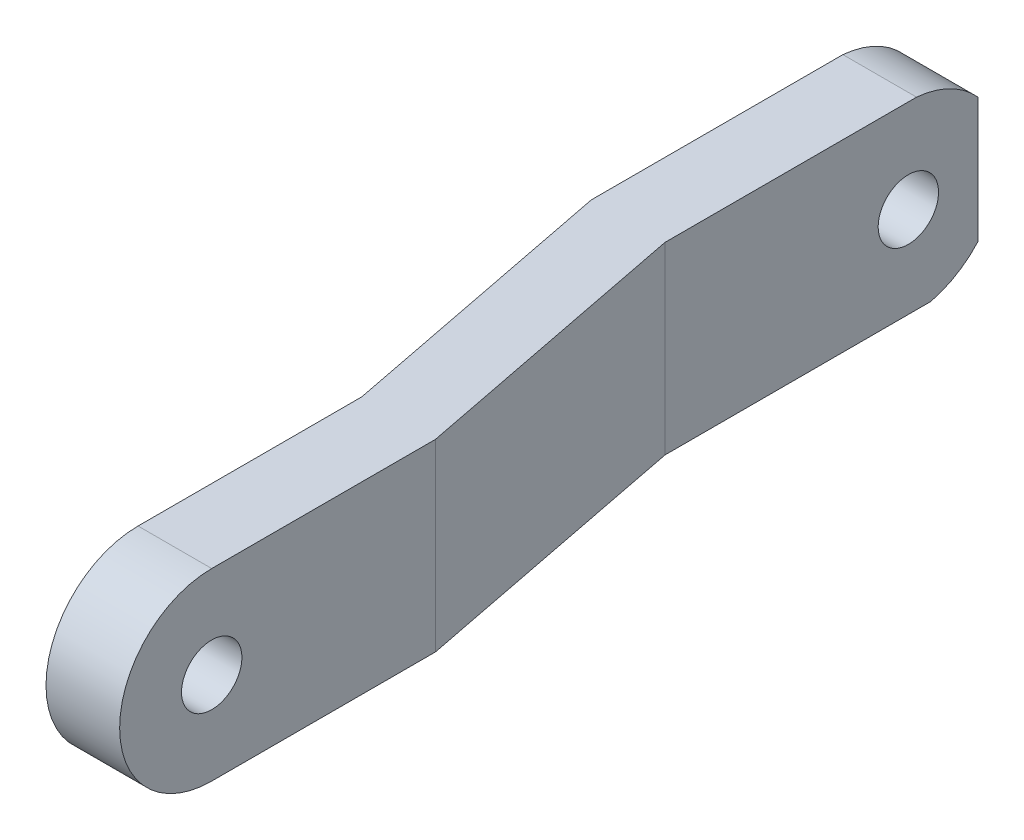
ISO-10303-21;
HEADER;
FILE_DESCRIPTION(('STEP AP214'),'2;1');
FILE_NAME('part.step','',(''),(''),'','','');
FILE_SCHEMA(('AUTOMOTIVE_DESIGN { 1 0 10303 214 1 1 1 1 }'));
ENDSEC;
DATA;
#1=APPLICATION_CONTEXT('core data for automotive mechanical design processes');
#2=APPLICATION_PROTOCOL_DEFINITION('international standard','automotive_design',2000,#1);
#3=PRODUCT_CONTEXT('',#1,'mechanical');
#4=PRODUCT('Part','Part','',(#3));
#5=PRODUCT_RELATED_PRODUCT_CATEGORY('part','',(#4));
#6=PRODUCT_DEFINITION_FORMATION('','',#4);
#7=PRODUCT_DEFINITION_CONTEXT('part definition',#1,'design');
#8=PRODUCT_DEFINITION('design','',#6,#7);
#9=PRODUCT_DEFINITION_SHAPE('','',#8);
#10=(LENGTH_UNIT() NAMED_UNIT(*) SI_UNIT(.MILLI.,.METRE.));
#11=(NAMED_UNIT(*) PLANE_ANGLE_UNIT() SI_UNIT($,.RADIAN.));
#12=(NAMED_UNIT(*) SI_UNIT($,.STERADIAN.) SOLID_ANGLE_UNIT());
#13=UNCERTAINTY_MEASURE_WITH_UNIT(LENGTH_MEASURE(1.E-05),#10,'distance_accuracy_value','');
#14=(GEOMETRIC_REPRESENTATION_CONTEXT(3) GLOBAL_UNCERTAINTY_ASSIGNED_CONTEXT((#13)) GLOBAL_UNIT_ASSIGNED_CONTEXT((#10,
#11,#12)) REPRESENTATION_CONTEXT('',''));
#15=CARTESIAN_POINT('',(0.,0.,0.));
#16=DIRECTION('',(0.,0.,1.));
#17=DIRECTION('',(1.,0.,0.));
#18=AXIS2_PLACEMENT_3D('',#15,#16,#17);
#19=CARTESIAN_POINT('',(-24.0152989227147,6.35,28.3544192887907));
#20=DIRECTION('',(1.,0.,0.));
#21=DIRECTION('',(0.,0.,-1.));
#22=AXIS2_PLACEMENT_3D('',#19,#20,#21);
#23=PLANE('',#22);
#24=CARTESIAN_POINT('',(-24.0152989227147,3.175,25.1794192887907));
#25=DIRECTION('',(-1.,0.,0.));
#26=DIRECTION('',(0.,0.,1.));
#27=AXIS2_PLACEMENT_3D('',#24,#25,#26);
#28=CIRCLE('',#27,1.0414);
#29=CARTESIAN_POINT('',(-24.0152989227147,3.175,26.2208192887907));
#30=VERTEX_POINT('',#29);
#31=EDGE_CURVE('E253',#30,#30,#28,.T.);
#32=ORIENTED_EDGE('',*,*,#31,.F.);
#33=EDGE_LOOP('',(#32));
#34=FACE_BOUND('',#33,.T.);
#35=DIRECTION('',(0.,0.,1.));
#36=VECTOR('',#35,1.);
#37=CARTESIAN_POINT('',(-24.0152989227147,0.,28.3544192887907));
#38=LINE('',#37,#36);
#39=CARTESIAN_POINT('',(-24.0152989227147,0.,17.4602684564927));
#40=VERTEX_POINT('',#39);
#41=CARTESIAN_POINT('',(-24.0152989227147,0.,25.1794192887907));
#42=VERTEX_POINT('',#41);
#43=EDGE_CURVE('E192',#40,#42,#38,.T.);
#44=ORIENTED_EDGE('',*,*,#43,.T.);
#45=CARTESIAN_POINT('',(-24.0152989227147,3.175,25.1794192887907));
#46=DIRECTION('',(1.,0.,0.));
#47=DIRECTION('',(0.,0.,-1.));
#48=AXIS2_PLACEMENT_3D('',#45,#46,#47);
#49=CIRCLE('',#48,3.175);
#50=CARTESIAN_POINT('',(-24.0152989227147,6.35,25.1794192887907));
#51=VERTEX_POINT('',#50);
#52=EDGE_CURVE('E220',#51,#42,#49,.T.);
#53=ORIENTED_EDGE('',*,*,#52,.F.);
#54=DIRECTION('',(0.,0.,1.));
#55=VECTOR('',#54,1.);
#56=CARTESIAN_POINT('',(-24.0152989227147,6.35,25.1794192887907));
#57=LINE('',#56,#55);
#58=CARTESIAN_POINT('',(-24.0152989227147,6.35,17.4602684564927));
#59=VERTEX_POINT('',#58);
#60=EDGE_CURVE('E229',#59,#51,#57,.T.);
#61=ORIENTED_EDGE('',*,*,#60,.F.);
#62=DIRECTION('',(0.,-1.,0.));
#63=VECTOR('',#62,1.);
#64=CARTESIAN_POINT('',(-24.0152989227147,6.35,17.4602684564927));
#65=LINE('',#64,#63);
#66=EDGE_CURVE('E197',#59,#40,#65,.T.);
#67=ORIENTED_EDGE('',*,*,#66,.T.);
#68=EDGE_LOOP('',(#44,#53,#61,#67));
#69=FACE_BOUND('',#68,.T.);
#70=ADVANCED_FACE('F77',(#34,#69),#23,.F.);
#71=CARTESIAN_POINT('',(-21.4752989227154,6.35,25.1794192887907));
#72=DIRECTION('',(-1.,0.,0.));
#73=DIRECTION('',(0.,0.,1.));
#74=AXIS2_PLACEMENT_3D('',#71,#72,#73);
#75=PLANE('',#74);
#76=CARTESIAN_POINT('',(-21.4752989227147,3.175,25.1794192887907));
#77=DIRECTION('',(-1.,0.,0.));
#78=DIRECTION('',(0.,0.,1.));
#79=AXIS2_PLACEMENT_3D('',#76,#77,#78);
#80=CIRCLE('',#79,1.0414);
#81=CARTESIAN_POINT('',(-21.4752989227147,3.175,26.2208192887907));
#82=VERTEX_POINT('',#81);
#83=EDGE_CURVE('E250',#82,#82,#80,.T.);
#84=ORIENTED_EDGE('',*,*,#83,.T.);
#85=EDGE_LOOP('',(#84));
#86=FACE_BOUND('',#85,.T.);
#87=CARTESIAN_POINT('',(-21.4752989227154,3.175,25.1794192887907));
#88=DIRECTION('',(-1.,0.,0.));
#89=DIRECTION('',(0.,0.,1.));
#90=AXIS2_PLACEMENT_3D('',#87,#88,#89);
#91=CIRCLE('',#90,3.175);
#92=CARTESIAN_POINT('',(-21.4752989227154,0.,25.1794192887907));
#93=VERTEX_POINT('',#92);
#94=CARTESIAN_POINT('',(-21.4752989227154,6.35,25.1794192887907));
#95=VERTEX_POINT('',#94);
#96=EDGE_CURVE('E86',#93,#95,#91,.T.);
#97=ORIENTED_EDGE('',*,*,#96,.F.);
#98=DIRECTION('',(0.,0.,-1.));
#99=VECTOR('',#98,1.);
#100=CARTESIAN_POINT('',(-21.4752989227154,0.,25.1794192887907));
#101=LINE('',#100,#99);
#102=CARTESIAN_POINT('',(-21.4752989227154,0.,17.4602684564927));
#103=VERTEX_POINT('',#102);
#104=EDGE_CURVE('E168',#93,#103,#101,.T.);
#105=ORIENTED_EDGE('',*,*,#104,.T.);
#106=DIRECTION('',(0.,-1.,0.));
#107=VECTOR('',#106,1.);
#108=CARTESIAN_POINT('',(-21.4752989227154,6.35,17.4602684564927));
#109=LINE('',#108,#107);
#110=CARTESIAN_POINT('',(-21.4752989227154,6.35,17.4602684564927));
#111=VERTEX_POINT('',#110);
#112=EDGE_CURVE('E163',#111,#103,#109,.T.);
#113=ORIENTED_EDGE('',*,*,#112,.F.);
#114=DIRECTION('',(0.,0.,-1.));
#115=VECTOR('',#114,1.);
#116=CARTESIAN_POINT('',(-21.4752989227154,6.35,28.3544192887907));
#117=LINE('',#116,#115);
#118=EDGE_CURVE('E231',#95,#111,#117,.T.);
#119=ORIENTED_EDGE('',*,*,#118,.F.);
#120=EDGE_LOOP('',(#97,#105,#113,#119));
#121=FACE_BOUND('',#120,.T.);
#122=ADVANCED_FACE('F284',(#86,#121),#75,.F.);
#123=CARTESIAN_POINT('',(-23.4003642113973,6.35,-3.17499999999999));
#124=DIRECTION('',(-1.,0.,0.));
#125=DIRECTION('',(0.,0.,1.));
#126=AXIS2_PLACEMENT_3D('',#123,#124,#125);
#127=PLANE('',#126);
#128=CARTESIAN_POINT('',(-23.400364211397,3.13423834564291,-0.772853493893282));
#129=DIRECTION('',(-1.,0.,0.));
#130=DIRECTION('',(0.,0.,1.));
#131=AXIS2_PLACEMENT_3D('',#128,#129,#130);
#132=CIRCLE('',#131,1.0414);
#133=CARTESIAN_POINT('',(-23.400364211397,3.13423834564291,0.268546506106718));
#134=VERTEX_POINT('',#133);
#135=EDGE_CURVE('E256',#134,#134,#132,.T.);
#136=ORIENTED_EDGE('',*,*,#135,.T.);
#137=EDGE_LOOP('',(#136));
#138=FACE_BOUND('',#137,.T.);
#139=CARTESIAN_POINT('',(-23.4003642113973,3.13423834564291,-0.772853493893282));
#140=DIRECTION('',(-1.,0.,0.));
#141=DIRECTION('',(0.,0.,1.));
#142=AXIS2_PLACEMENT_3D('',#139,#140,#141);
#143=CIRCLE('',#142,3.22811903905688);
#144=CARTESIAN_POINT('',(-23.4003642113973,0.977749371982068,-3.175));
#145=VERTEX_POINT('',#144);
#146=CARTESIAN_POINT('',(-23.4003642113973,0.,-1.54570698778658));
#147=VERTEX_POINT('',#146);
#148=EDGE_CURVE('E213',#145,#147,#143,.T.);
#149=ORIENTED_EDGE('',*,*,#148,.F.);
#150=DIRECTION('',(0.,-1.,0.));
#151=VECTOR('',#150,1.);
#152=CARTESIAN_POINT('',(-23.4003642113973,6.35,-3.17499999999999));
#153=LINE('',#152,#151);
#154=CARTESIAN_POINT('',(-23.4003642113973,5.29072731930376,-3.175));
#155=VERTEX_POINT('',#154);
#156=EDGE_CURVE('E206',#155,#145,#153,.T.);
#157=ORIENTED_EDGE('',*,*,#156,.F.);
#158=CARTESIAN_POINT('',(-23.4003642113973,3.13423834564291,-0.772853493893282));
#159=DIRECTION('',(-1.,0.,0.));
#160=DIRECTION('',(0.,0.,1.));
#161=AXIS2_PLACEMENT_3D('',#158,#159,#160);
#162=CIRCLE('',#161,3.22811903905688);
#163=CARTESIAN_POINT('',(-23.4003642113973,6.35,-1.05504051111425));
#164=VERTEX_POINT('',#163);
#165=EDGE_CURVE('E182',#164,#155,#162,.T.);
#166=ORIENTED_EDGE('',*,*,#165,.F.);
#167=DIRECTION('',(0.,0.,-1.));
#168=VECTOR('',#167,1.);
#169=CARTESIAN_POINT('',(-23.4003642113973,6.35,-3.17499999999999));
#170=LINE('',#169,#168);
#171=CARTESIAN_POINT('',(-23.4003642113973,6.35,7.62000000000211));
#172=VERTEX_POINT('',#171);
#173=EDGE_CURVE('E167',#172,#164,#170,.T.);
#174=ORIENTED_EDGE('',*,*,#173,.F.);
#175=DIRECTION('',(0.,-1.,0.));
#176=VECTOR('',#175,1.);
#177=CARTESIAN_POINT('',(-23.4003642113973,6.35,7.62000000000211));
#178=LINE('',#177,#176);
#179=CARTESIAN_POINT('',(-23.4003642113973,0.,7.62000000000211));
#180=VERTEX_POINT('',#179);
#181=EDGE_CURVE('E160',#172,#180,#178,.T.);
#182=ORIENTED_EDGE('',*,*,#181,.T.);
#183=DIRECTION('',(0.,0.,-1.));
#184=VECTOR('',#183,1.);
#185=CARTESIAN_POINT('',(-23.4003642113973,0.,-3.17499999999999));
#186=LINE('',#185,#184);
#187=EDGE_CURVE('E173',#180,#147,#186,.T.);
#188=ORIENTED_EDGE('',*,*,#187,.T.);
#189=EDGE_LOOP('',(#149,#157,#166,#174,#182,#188));
#190=FACE_BOUND('',#189,.T.);
#191=ADVANCED_FACE('F79',(#138,#190),#127,.F.);
#192=CARTESIAN_POINT('',(-25.940364211397,6.35,-3.17499999999999));
#193=DIRECTION('',(0.,0.,1.));
#194=DIRECTION('',(1.,0.,0.));
#195=AXIS2_PLACEMENT_3D('',#192,#193,#194);
#196=PLANE('',#195);
#197=DIRECTION('',(-1.,0.,0.));
#198=VECTOR('',#197,1.);
#199=CARTESIAN_POINT('',(-22.384364211397,0.977749371982068,-3.175));
#200=LINE('',#199,#198);
#201=CARTESIAN_POINT('',(-25.940364211397,0.977749371982068,-3.17499999999999));
#202=VERTEX_POINT('',#201);
#203=EDGE_CURVE('E217',#145,#202,#200,.T.);
#204=ORIENTED_EDGE('',*,*,#203,.T.);
#205=DIRECTION('',(0.,-1.,0.));
#206=VECTOR('',#205,1.);
#207=CARTESIAN_POINT('',(-25.940364211397,6.35,-3.17499999999999));
#208=LINE('',#207,#206);
#209=CARTESIAN_POINT('',(-25.940364211397,5.29072731930376,-3.17499999999999));
#210=VERTEX_POINT('',#209);
#211=EDGE_CURVE('E203',#210,#202,#208,.T.);
#212=ORIENTED_EDGE('',*,*,#211,.F.);
#213=DIRECTION('',(-1.,0.,0.));
#214=VECTOR('',#213,1.);
#215=CARTESIAN_POINT('',(-22.384364211397,5.29072731930376,-3.175));
#216=LINE('',#215,#214);
#217=EDGE_CURVE('E214',#155,#210,#216,.T.);
#218=ORIENTED_EDGE('',*,*,#217,.F.);
#219=ORIENTED_EDGE('',*,*,#156,.T.);
#220=EDGE_LOOP('',(#204,#212,#218,#219));
#221=FACE_BOUND('',#220,.T.);
#222=ADVANCED_FACE('F274',(#221),#196,.F.);
#223=CARTESIAN_POINT('',(-25.940364211397,6.35,-3.17499999999999));
#224=DIRECTION('',(1.,0.,0.));
#225=DIRECTION('',(0.,0.,-1.));
#226=AXIS2_PLACEMENT_3D('',#223,#224,#225);
#227=PLANE('',#226);
#228=CARTESIAN_POINT('',(-25.940364211397,3.13423834564291,-0.77285349389328));
#229=DIRECTION('',(-1.,0.,0.));
#230=DIRECTION('',(0.,0.,1.));
#231=AXIS2_PLACEMENT_3D('',#228,#229,#230);
#232=CIRCLE('',#231,1.0414);
#233=CARTESIAN_POINT('',(-25.940364211397,3.13423834564291,0.26854650610672));
#234=VERTEX_POINT('',#233);
#235=EDGE_CURVE('E259',#234,#234,#232,.T.);
#236=ORIENTED_EDGE('',*,*,#235,.F.);
#237=EDGE_LOOP('',(#236));
#238=FACE_BOUND('',#237,.T.);
#239=CARTESIAN_POINT('',(-25.940364211397,3.13423834564291,-0.77285349389328));
#240=DIRECTION('',(-1.,0.,0.));
#241=DIRECTION('',(0.,0.,1.));
#242=AXIS2_PLACEMENT_3D('',#239,#240,#241);
#243=CIRCLE('',#242,3.22811903905688);
#244=CARTESIAN_POINT('',(-25.940364211397,0.,-1.54570698778658));
#245=VERTEX_POINT('',#244);
#246=EDGE_CURVE('E109',#202,#245,#243,.T.);
#247=ORIENTED_EDGE('',*,*,#246,.T.);
#248=DIRECTION('',(0.,0.,1.));
#249=VECTOR('',#248,1.);
#250=CARTESIAN_POINT('',(-25.940364211397,0.,-3.17499999999999));
#251=LINE('',#250,#249);
#252=CARTESIAN_POINT('',(-25.940364211397,0.,7.62000000000012));
#253=VERTEX_POINT('',#252);
#254=EDGE_CURVE('E181',#245,#253,#251,.T.);
#255=ORIENTED_EDGE('',*,*,#254,.T.);
#256=DIRECTION('',(0.,-1.,0.));
#257=VECTOR('',#256,1.);
#258=CARTESIAN_POINT('',(-25.940364211397,6.35,7.62000000000012));
#259=LINE('',#258,#257);
#260=CARTESIAN_POINT('',(-25.940364211397,6.35,7.62000000000012));
#261=VERTEX_POINT('',#260);
#262=EDGE_CURVE('E200',#261,#253,#259,.T.);
#263=ORIENTED_EDGE('',*,*,#262,.F.);
#264=DIRECTION('',(0.,0.,1.));
#265=VECTOR('',#264,1.);
#266=CARTESIAN_POINT('',(-25.940364211397,6.35,-3.17499999999999));
#267=LINE('',#266,#265);
#268=CARTESIAN_POINT('',(-25.940364211397,6.35,-1.05504051111425));
#269=VERTEX_POINT('',#268);
#270=EDGE_CURVE('E225',#269,#261,#267,.T.);
#271=ORIENTED_EDGE('',*,*,#270,.F.);
#272=CARTESIAN_POINT('',(-25.940364211397,3.13423834564291,-0.77285349389328));
#273=DIRECTION('',(-1.,0.,0.));
#274=DIRECTION('',(0.,0.,1.));
#275=AXIS2_PLACEMENT_3D('',#272,#273,#274);
#276=CIRCLE('',#275,3.22811903905688);
#277=EDGE_CURVE('E94',#269,#210,#276,.T.);
#278=ORIENTED_EDGE('',*,*,#277,.T.);
#279=ORIENTED_EDGE('',*,*,#211,.T.);
#280=EDGE_LOOP('',(#247,#255,#263,#271,#278,#279));
#281=FACE_BOUND('',#280,.T.);
#282=ADVANCED_FACE('F237',(#238,#281),#227,.F.);
#283=CARTESIAN_POINT('',(0.,6.35,0.));
#284=DIRECTION('',(0.,-1.,0.));
#285=DIRECTION('',(0.,0.,-1.));
#286=AXIS2_PLACEMENT_3D('',#283,#284,#285);
#287=PLANE('',#286);
#288=ORIENTED_EDGE('',*,*,#60,.T.);
#289=DIRECTION('',(1.,0.,0.));
#290=VECTOR('',#289,1.);
#291=CARTESIAN_POINT('',(-25.940364211397,6.35,25.1794192887907));
#292=LINE('',#291,#290);
#293=EDGE_CURVE('E245',#51,#95,#292,.T.);
#294=ORIENTED_EDGE('',*,*,#293,.T.);
#295=ORIENTED_EDGE('',*,*,#118,.T.);
#296=DIRECTION('',(-0.191991950783408,0.,-0.981396500316962));
#297=VECTOR('',#296,1.);
#298=CARTESIAN_POINT('',(-23.4003642113973,6.35,7.62000000000211));
#299=LINE('',#298,#297);
#300=EDGE_CURVE('E176',#111,#172,#299,.T.);
#301=ORIENTED_EDGE('',*,*,#300,.T.);
#302=ORIENTED_EDGE('',*,*,#173,.T.);
#303=DIRECTION('',(-1.,0.,0.));
#304=VECTOR('',#303,1.);
#305=CARTESIAN_POINT('',(-22.384364211397,6.35,-1.05504051111425));
#306=LINE('',#305,#304);
#307=EDGE_CURVE('E210',#269,#164,#306,.F.);
#308=ORIENTED_EDGE('',*,*,#307,.F.);
#309=ORIENTED_EDGE('',*,*,#270,.T.);
#310=DIRECTION('',(0.191991950783408,0.,0.981396500316962));
#311=VECTOR('',#310,1.);
#312=CARTESIAN_POINT('',(-25.940364211397,6.35,7.62000000000012));
#313=LINE('',#312,#311);
#314=EDGE_CURVE('E227',#261,#59,#313,.T.);
#315=ORIENTED_EDGE('',*,*,#314,.T.);
#316=EDGE_LOOP('',(#288,#294,#295,#301,#302,#308,#309,#315));
#317=FACE_BOUND('',#316,.T.);
#318=ADVANCED_FACE('F234',(#317),#287,.F.);
#319=CARTESIAN_POINT('',(0.,0.,0.));
#320=DIRECTION('',(0.,-1.,0.));
#321=DIRECTION('',(0.,0.,-1.));
#322=AXIS2_PLACEMENT_3D('',#319,#320,#321);
#323=PLANE('',#322);
#324=DIRECTION('',(-1.,0.,0.));
#325=VECTOR('',#324,1.);
#326=CARTESIAN_POINT('',(-20.4592989227147,0.,25.1794192887907));
#327=LINE('',#326,#325);
#328=EDGE_CURVE('E12',#42,#93,#327,.F.);
#329=ORIENTED_EDGE('',*,*,#328,.F.);
#330=ORIENTED_EDGE('',*,*,#43,.F.);
#331=DIRECTION('',(0.191991950783408,0.,0.981396500316962));
#332=VECTOR('',#331,1.);
#333=CARTESIAN_POINT('',(-25.940364211397,0.,7.62000000000012));
#334=LINE('',#333,#332);
#335=EDGE_CURVE('E184',#253,#40,#334,.T.);
#336=ORIENTED_EDGE('',*,*,#335,.F.);
#337=ORIENTED_EDGE('',*,*,#254,.F.);
#338=DIRECTION('',(-1.,0.,0.));
#339=VECTOR('',#338,1.);
#340=CARTESIAN_POINT('',(-22.384364211397,0.,-1.54570698778658));
#341=LINE('',#340,#339);
#342=EDGE_CURVE('E113',#245,#147,#341,.F.);
#343=ORIENTED_EDGE('',*,*,#342,.T.);
#344=ORIENTED_EDGE('',*,*,#187,.F.);
#345=DIRECTION('',(-0.191991950783408,0.,-0.981396500316962));
#346=VECTOR('',#345,1.);
#347=CARTESIAN_POINT('',(-23.4003642113973,0.,7.62000000000211));
#348=LINE('',#347,#346);
#349=EDGE_CURVE('E156',#103,#180,#348,.T.);
#350=ORIENTED_EDGE('',*,*,#349,.F.);
#351=ORIENTED_EDGE('',*,*,#104,.F.);
#352=EDGE_LOOP('',(#329,#330,#336,#337,#343,#344,#350,#351));
#353=FACE_BOUND('',#352,.T.);
#354=ADVANCED_FACE('F179',(#353),#323,.T.);
#355=CARTESIAN_POINT('',(-25.940364211397,6.35,7.62000000000012));
#356=DIRECTION('',(0.981396500316962,0.,-0.191991950783408));
#357=DIRECTION('',(-0.191991950783408,0.,-0.981396500316962));
#358=AXIS2_PLACEMENT_3D('',#355,#356,#357);
#359=PLANE('',#358);
#360=ORIENTED_EDGE('',*,*,#335,.T.);
#361=ORIENTED_EDGE('',*,*,#66,.F.);
#362=ORIENTED_EDGE('',*,*,#314,.F.);
#363=ORIENTED_EDGE('',*,*,#262,.T.);
#364=EDGE_LOOP('',(#360,#361,#362,#363));
#365=FACE_BOUND('',#364,.T.);
#366=ADVANCED_FACE('F243',(#365),#359,.F.);
#367=CARTESIAN_POINT('',(-23.4003642113973,6.35,7.62000000000211));
#368=DIRECTION('',(-0.981396500316962,0.,0.191991950783408));
#369=DIRECTION('',(0.191991950783408,0.,0.981396500316962));
#370=AXIS2_PLACEMENT_3D('',#367,#368,#369);
#371=PLANE('',#370);
#372=ORIENTED_EDGE('',*,*,#349,.T.);
#373=ORIENTED_EDGE('',*,*,#181,.F.);
#374=ORIENTED_EDGE('',*,*,#300,.F.);
#375=ORIENTED_EDGE('',*,*,#112,.T.);
#376=EDGE_LOOP('',(#372,#373,#374,#375));
#377=FACE_BOUND('',#376,.T.);
#378=ADVANCED_FACE('F158',(#377),#371,.F.);
#379=CARTESIAN_POINT('',(-22.384364211397,3.13423834564291,-0.772853493893283));
#380=DIRECTION('',(-1.,0.,0.));
#381=DIRECTION('',(0.,0.,1.));
#382=AXIS2_PLACEMENT_3D('',#379,#380,#381);
#383=CYLINDRICAL_SURFACE('',#382,3.22811903905688);
#384=ORIENTED_EDGE('',*,*,#148,.T.);
#385=ORIENTED_EDGE('',*,*,#342,.F.);
#386=ORIENTED_EDGE('',*,*,#246,.F.);
#387=ORIENTED_EDGE('',*,*,#203,.F.);
#388=EDGE_LOOP('',(#384,#385,#386,#387));
#389=FACE_BOUND('',#388,.T.);
#390=ADVANCED_FACE('F299',(#389),#383,.T.);
#391=CARTESIAN_POINT('',(-22.384364211397,3.13423834564291,-0.772853493893283));
#392=DIRECTION('',(-1.,0.,0.));
#393=DIRECTION('',(0.,0.,1.));
#394=AXIS2_PLACEMENT_3D('',#391,#392,#393);
#395=CYLINDRICAL_SURFACE('',#394,3.22811903905688);
#396=ORIENTED_EDGE('',*,*,#165,.T.);
#397=ORIENTED_EDGE('',*,*,#217,.T.);
#398=ORIENTED_EDGE('',*,*,#277,.F.);
#399=ORIENTED_EDGE('',*,*,#307,.T.);
#400=EDGE_LOOP('',(#396,#397,#398,#399));
#401=FACE_BOUND('',#400,.T.);
#402=ADVANCED_FACE('F304',(#401),#395,.T.);
#403=CARTESIAN_POINT('',(-25.940364211397,3.175,25.1794192887907));
#404=DIRECTION('',(1.,0.,0.));
#405=DIRECTION('',(0.,0.,-1.));
#406=AXIS2_PLACEMENT_3D('',#403,#404,#405);
#407=CYLINDRICAL_SURFACE('',#406,3.175);
#408=ORIENTED_EDGE('',*,*,#52,.T.);
#409=ORIENTED_EDGE('',*,*,#328,.T.);
#410=ORIENTED_EDGE('',*,*,#96,.T.);
#411=ORIENTED_EDGE('',*,*,#293,.F.);
#412=EDGE_LOOP('',(#408,#409,#410,#411));
#413=FACE_BOUND('',#412,.T.);
#414=ADVANCED_FACE('F307',(#413),#407,.T.);
#415=CARTESIAN_POINT('',(-21.4752989227147,3.175,25.1794192887907));
#416=DIRECTION('',(-1.,0.,0.));
#417=DIRECTION('',(0.,0.,1.));
#418=AXIS2_PLACEMENT_3D('',#415,#416,#417);
#419=CYLINDRICAL_SURFACE('',#418,1.0414);
#420=ORIENTED_EDGE('',*,*,#83,.F.);
#421=EDGE_LOOP('',(#420));
#422=FACE_BOUND('',#421,.T.);
#423=ORIENTED_EDGE('',*,*,#31,.T.);
#424=EDGE_LOOP('',(#423));
#425=FACE_BOUND('',#424,.T.);
#426=ADVANCED_FACE('F269',(#422,#425),#419,.F.);
#427=CARTESIAN_POINT('',(-23.400364211397,3.13423834564291,-0.772853493893282));
#428=DIRECTION('',(-1.,0.,0.));
#429=DIRECTION('',(0.,0.,1.));
#430=AXIS2_PLACEMENT_3D('',#427,#428,#429);
#431=CYLINDRICAL_SURFACE('',#430,1.0414);
#432=ORIENTED_EDGE('',*,*,#135,.F.);
#433=EDGE_LOOP('',(#432));
#434=FACE_BOUND('',#433,.T.);
#435=ORIENTED_EDGE('',*,*,#235,.T.);
#436=EDGE_LOOP('',(#435));
#437=FACE_BOUND('',#436,.T.);
#438=ADVANCED_FACE('F266',(#434,#437),#431,.F.);
#439=CLOSED_SHELL('',(#70,#122,#191,#222,#282,#318,#354,#366,#378,#390,#402,#414,#426,#438));
#440=MANIFOLD_SOLID_BREP('B2',#439);
#441=ADVANCED_BREP_SHAPE_REPRESENTATION('',(#18,#440),#14);
#442=SHAPE_DEFINITION_REPRESENTATION(#9,#441);
ENDSEC;
END-ISO-10303-21;
